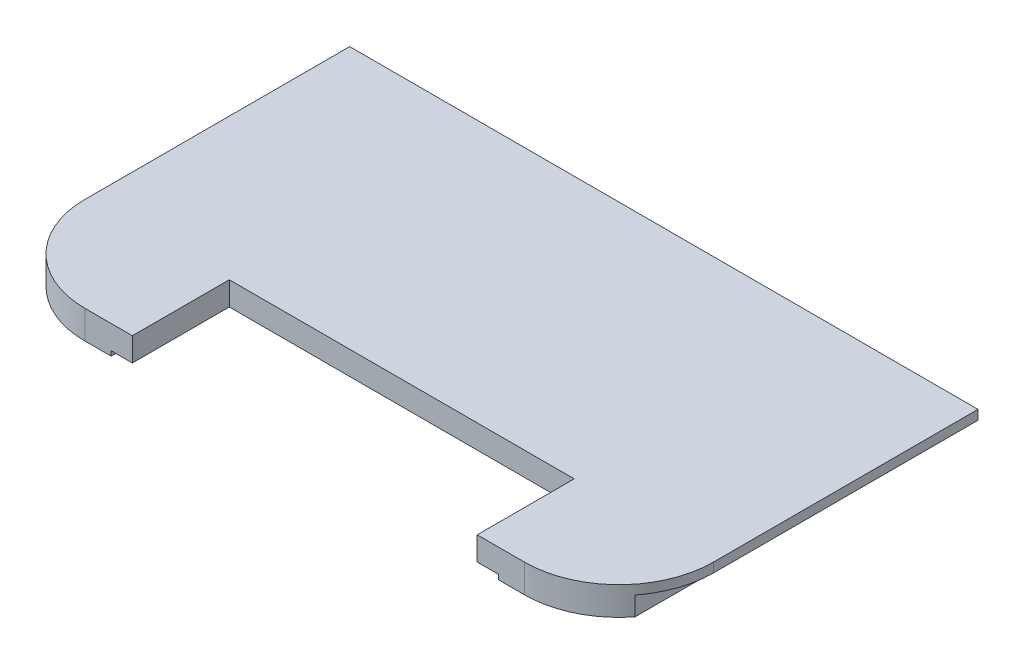
ISO-10303-21;
HEADER;
FILE_DESCRIPTION(('STEP AP214'),'2;1');
FILE_NAME('part.step','',(''),(''),'','','');
FILE_SCHEMA(('AUTOMOTIVE_DESIGN { 1 0 10303 214 1 1 1 1 }'));
ENDSEC;
DATA;
#1=APPLICATION_CONTEXT('core data for automotive mechanical design processes');
#2=APPLICATION_PROTOCOL_DEFINITION('international standard','automotive_design',2000,#1);
#3=PRODUCT_CONTEXT('',#1,'mechanical');
#4=PRODUCT('Part','Part','',(#3));
#5=PRODUCT_RELATED_PRODUCT_CATEGORY('part','',(#4));
#6=PRODUCT_DEFINITION_FORMATION('','',#4);
#7=PRODUCT_DEFINITION_CONTEXT('part definition',#1,'design');
#8=PRODUCT_DEFINITION('design','',#6,#7);
#9=PRODUCT_DEFINITION_SHAPE('','',#8);
#10=(LENGTH_UNIT() NAMED_UNIT(*) SI_UNIT(.MILLI.,.METRE.));
#11=(NAMED_UNIT(*) PLANE_ANGLE_UNIT() SI_UNIT($,.RADIAN.));
#12=(NAMED_UNIT(*) SI_UNIT($,.STERADIAN.) SOLID_ANGLE_UNIT());
#13=UNCERTAINTY_MEASURE_WITH_UNIT(LENGTH_MEASURE(1.E-05),#10,'distance_accuracy_value','');
#14=(GEOMETRIC_REPRESENTATION_CONTEXT(3) GLOBAL_UNCERTAINTY_ASSIGNED_CONTEXT((#13)) GLOBAL_UNIT_ASSIGNED_CONTEXT((#10,
#11,#12)) REPRESENTATION_CONTEXT('',''));
#15=CARTESIAN_POINT('',(0.,0.,0.));
#16=DIRECTION('',(0.,0.,1.));
#17=DIRECTION('',(1.,0.,0.));
#18=AXIS2_PLACEMENT_3D('',#15,#16,#17);
#19=CARTESIAN_POINT('',(211.1375,0.,-120.65));
#20=DIRECTION('',(0.,-1.,0.));
#21=DIRECTION('',(0.,0.,-1.));
#22=AXIS2_PLACEMENT_3D('',#19,#20,#21);
#23=PLANE('',#22);
#24=DIRECTION('',(0.,0.,1.));
#25=VECTOR('',#24,1.);
#26=CARTESIAN_POINT('',(197.64375,0.,-120.651));
#27=LINE('',#26,#25);
#28=CARTESIAN_POINT('',(197.64375,0.,-120.65));
#29=VERTEX_POINT('',#28);
#30=CARTESIAN_POINT('',(197.64375,0.,96.2859803880969));
#31=VERTEX_POINT('',#30);
#32=EDGE_CURVE('E333',#29,#31,#27,.T.);
#33=ORIENTED_EDGE('',*,*,#32,.T.);
#34=CARTESIAN_POINT('',(147.6375,0.,57.15));
#35=DIRECTION('',(0.,-1.,0.));
#36=DIRECTION('',(0.,0.,-1.));
#37=AXIS2_PLACEMENT_3D('',#34,#35,#36);
#38=CIRCLE('',#37,63.5);
#39=CARTESIAN_POINT('',(147.6375,0.,120.65));
#40=VERTEX_POINT('',#39);
#41=EDGE_CURVE('E308',#31,#40,#38,.T.);
#42=ORIENTED_EDGE('',*,*,#41,.T.);
#43=DIRECTION('',(1.,0.,0.));
#44=VECTOR('',#43,1.);
#45=CARTESIAN_POINT('',(-211.1375,0.,120.65));
#46=LINE('',#45,#44);
#47=CARTESIAN_POINT('',(130.175,0.,120.65));
#48=VERTEX_POINT('',#47);
#49=EDGE_CURVE('E298',#48,#40,#46,.T.);
#50=ORIENTED_EDGE('',*,*,#49,.F.);
#51=DIRECTION('',(0.,0.,1.));
#52=VECTOR('',#51,1.);
#53=CARTESIAN_POINT('',(130.175,0.,-120.651));
#54=LINE('',#53,#52);
#55=CARTESIAN_POINT('',(130.175,0.,-120.65));
#56=VERTEX_POINT('',#55);
#57=EDGE_CURVE('E344',#56,#48,#54,.T.);
#58=ORIENTED_EDGE('',*,*,#57,.F.);
#59=DIRECTION('',(-1.,0.,0.));
#60=VECTOR('',#59,1.);
#61=CARTESIAN_POINT('',(-211.1375,0.,-120.65));
#62=LINE('',#61,#60);
#63=EDGE_CURVE('E296',#29,#56,#62,.T.);
#64=ORIENTED_EDGE('',*,*,#63,.F.);
#65=EDGE_LOOP('',(#33,#42,#50,#58,#64));
#66=FACE_BOUND('',#65,.T.);
#67=ADVANCED_FACE('F31',(#66),#23,.T.);
#68=CARTESIAN_POINT('',(-147.6375,0.,120.65));
#69=VERTEX_POINT('',#68);
#70=CARTESIAN_POINT('',(-130.175,0.,120.65));
#71=VERTEX_POINT('',#70);
#72=EDGE_CURVE('E289',#69,#71,#46,.T.);
#73=ORIENTED_EDGE('',*,*,#72,.F.);
#74=CARTESIAN_POINT('',(-147.6375,0.,57.15));
#75=DIRECTION('',(0.,-1.,0.));
#76=DIRECTION('',(0.,0.,-1.));
#77=AXIS2_PLACEMENT_3D('',#74,#75,#76);
#78=CIRCLE('',#77,63.5);
#79=CARTESIAN_POINT('',(-197.64375,0.,96.2859803880969));
#80=VERTEX_POINT('',#79);
#81=EDGE_CURVE('E205',#69,#80,#78,.T.);
#82=ORIENTED_EDGE('',*,*,#81,.T.);
#83=DIRECTION('',(0.,0.,1.));
#84=VECTOR('',#83,1.);
#85=CARTESIAN_POINT('',(-197.64375,0.,-120.651));
#86=LINE('',#85,#84);
#87=CARTESIAN_POINT('',(-197.64375,0.,-120.65));
#88=VERTEX_POINT('',#87);
#89=EDGE_CURVE('E323',#88,#80,#86,.T.);
#90=ORIENTED_EDGE('',*,*,#89,.F.);
#91=CARTESIAN_POINT('',(-130.175,0.,-120.65));
#92=VERTEX_POINT('',#91);
#93=EDGE_CURVE('E281',#92,#88,#62,.T.);
#94=ORIENTED_EDGE('',*,*,#93,.F.);
#95=DIRECTION('',(0.,0.,1.));
#96=VECTOR('',#95,1.);
#97=CARTESIAN_POINT('',(-130.175,0.,-120.651));
#98=LINE('',#97,#96);
#99=EDGE_CURVE('E259',#92,#71,#98,.T.);
#100=ORIENTED_EDGE('',*,*,#99,.T.);
#101=EDGE_LOOP('',(#73,#82,#90,#94,#100));
#102=FACE_BOUND('',#101,.T.);
#103=ADVANCED_FACE('F321',(#102),#23,.T.);
#104=CARTESIAN_POINT('',(-211.1375,19.05,120.65));
#105=DIRECTION('',(0.,0.,-1.));
#106=DIRECTION('',(-1.,0.,0.));
#107=AXIS2_PLACEMENT_3D('',#104,#105,#106);
#108=PLANE('',#107);
#109=DIRECTION('',(1.,0.,0.));
#110=VECTOR('',#109,1.);
#111=CARTESIAN_POINT('',(-211.1375,19.05,120.65));
#112=LINE('',#111,#110);
#113=CARTESIAN_POINT('',(-147.6375,19.05,120.65));
#114=VERTEX_POINT('',#113);
#115=CARTESIAN_POINT('',(-115.8875,19.05,120.65));
#116=VERTEX_POINT('',#115);
#117=EDGE_CURVE('E294',#114,#116,#112,.T.);
#118=ORIENTED_EDGE('',*,*,#117,.F.);
#119=DIRECTION('',(0.,-1.,0.));
#120=VECTOR('',#119,1.);
#121=CARTESIAN_POINT('',(-147.6375,19.05,120.65));
#122=LINE('',#121,#120);
#123=EDGE_CURVE('E315',#114,#69,#122,.T.);
#124=ORIENTED_EDGE('',*,*,#123,.T.);
#125=ORIENTED_EDGE('',*,*,#72,.T.);
#126=DIRECTION('',(0.,-1.,0.));
#127=VECTOR('',#126,1.);
#128=CARTESIAN_POINT('',(-130.175,0.,120.65));
#129=LINE('',#128,#127);
#130=CARTESIAN_POINT('',(-130.175,3.175,120.65));
#131=VERTEX_POINT('',#130);
#132=EDGE_CURVE('E268',#131,#71,#129,.T.);
#133=ORIENTED_EDGE('',*,*,#132,.F.);
#134=DIRECTION('',(-1.,0.,0.));
#135=VECTOR('',#134,1.);
#136=CARTESIAN_POINT('',(-115.8875,3.175,120.65));
#137=LINE('',#136,#135);
#138=CARTESIAN_POINT('',(-115.8875,3.175,120.65));
#139=VERTEX_POINT('',#138);
#140=EDGE_CURVE('E349',#139,#131,#137,.T.);
#141=ORIENTED_EDGE('',*,*,#140,.F.);
#142=DIRECTION('',(0.,1.,0.));
#143=VECTOR('',#142,1.);
#144=CARTESIAN_POINT('',(-115.8875,-0.001000000000001,120.65));
#145=LINE('',#144,#143);
#146=EDGE_CURVE('E280',#139,#116,#145,.T.);
#147=ORIENTED_EDGE('',*,*,#146,.T.);
#148=EDGE_LOOP('',(#118,#124,#125,#133,#141,#147));
#149=FACE_BOUND('',#148,.T.);
#150=ADVANCED_FACE('F362',(#149),#108,.F.);
#151=CARTESIAN_POINT('',(211.1375,19.05,120.65));
#152=DIRECTION('',(-1.,0.,0.));
#153=DIRECTION('',(0.,0.,1.));
#154=AXIS2_PLACEMENT_3D('',#151,#152,#153);
#155=PLANE('',#154);
#156=DIRECTION('',(0.,-1.,0.));
#157=VECTOR('',#156,1.);
#158=CARTESIAN_POINT('',(211.1375,19.05,57.15));
#159=LINE('',#158,#157);
#160=CARTESIAN_POINT('',(211.1375,19.05,57.15));
#161=VERTEX_POINT('',#160);
#162=CARTESIAN_POINT('',(211.1375,12.7,57.15));
#163=VERTEX_POINT('',#162);
#164=EDGE_CURVE('E229',#161,#163,#159,.T.);
#165=ORIENTED_EDGE('',*,*,#164,.T.);
#166=DIRECTION('',(0.,0.,-1.));
#167=VECTOR('',#166,1.);
#168=CARTESIAN_POINT('',(211.1375,12.7,120.651));
#169=LINE('',#168,#167);
#170=CARTESIAN_POINT('',(211.1375,12.7,-120.65));
#171=VERTEX_POINT('',#170);
#172=EDGE_CURVE('E378',#163,#171,#169,.T.);
#173=ORIENTED_EDGE('',*,*,#172,.T.);
#174=DIRECTION('',(0.,-1.,0.));
#175=VECTOR('',#174,1.);
#176=CARTESIAN_POINT('',(211.1375,19.05,-120.65));
#177=LINE('',#176,#175);
#178=CARTESIAN_POINT('',(211.1375,19.05,-120.65));
#179=VERTEX_POINT('',#178);
#180=EDGE_CURVE('E230',#179,#171,#177,.T.);
#181=ORIENTED_EDGE('',*,*,#180,.F.);
#182=DIRECTION('',(0.,0.,-1.));
#183=VECTOR('',#182,1.);
#184=CARTESIAN_POINT('',(211.1375,19.05,120.65));
#185=LINE('',#184,#183);
#186=EDGE_CURVE('E286',#161,#179,#185,.T.);
#187=ORIENTED_EDGE('',*,*,#186,.F.);
#188=EDGE_LOOP('',(#165,#173,#181,#187));
#189=FACE_BOUND('',#188,.T.);
#190=ADVANCED_FACE('F407',(#189),#155,.F.);
#191=CARTESIAN_POINT('',(-211.1375,19.05,-120.65));
#192=DIRECTION('',(0.,0.,1.));
#193=DIRECTION('',(1.,0.,0.));
#194=AXIS2_PLACEMENT_3D('',#191,#192,#193);
#195=PLANE('',#194);
#196=DIRECTION('',(0.,-1.,0.));
#197=VECTOR('',#196,1.);
#198=CARTESIAN_POINT('',(-197.64375,0.,-120.65));
#199=LINE('',#198,#197);
#200=CARTESIAN_POINT('',(-197.64375,12.7,-120.65));
#201=VERTEX_POINT('',#200);
#202=EDGE_CURVE('E327',#201,#88,#199,.T.);
#203=ORIENTED_EDGE('',*,*,#202,.F.);
#204=DIRECTION('',(1.,0.,0.));
#205=VECTOR('',#204,1.);
#206=CARTESIAN_POINT('',(-211.1375,12.7000000000001,-120.65));
#207=LINE('',#206,#205);
#208=CARTESIAN_POINT('',(-211.1375,12.7000000000001,-120.65));
#209=VERTEX_POINT('',#208);
#210=EDGE_CURVE('E195',#209,#201,#207,.T.);
#211=ORIENTED_EDGE('',*,*,#210,.F.);
#212=DIRECTION('',(0.,-1.,0.));
#213=VECTOR('',#212,1.);
#214=CARTESIAN_POINT('',(-211.1375,19.05,-120.65));
#215=LINE('',#214,#213);
#216=CARTESIAN_POINT('',(-211.1375,19.05,-120.65));
#217=VERTEX_POINT('',#216);
#218=EDGE_CURVE('E194',#217,#209,#215,.T.);
#219=ORIENTED_EDGE('',*,*,#218,.F.);
#220=DIRECTION('',(-1.,0.,0.));
#221=VECTOR('',#220,1.);
#222=CARTESIAN_POINT('',(-211.1375,19.05,-120.65));
#223=LINE('',#222,#221);
#224=EDGE_CURVE('E288',#179,#217,#223,.T.);
#225=ORIENTED_EDGE('',*,*,#224,.F.);
#226=ORIENTED_EDGE('',*,*,#180,.T.);
#227=DIRECTION('',(1.,0.,0.));
#228=VECTOR('',#227,1.);
#229=CARTESIAN_POINT('',(197.64375,12.7,-120.65));
#230=LINE('',#229,#228);
#231=CARTESIAN_POINT('',(197.64375,12.7,-120.65));
#232=VERTEX_POINT('',#231);
#233=EDGE_CURVE('E185',#232,#171,#230,.T.);
#234=ORIENTED_EDGE('',*,*,#233,.F.);
#235=DIRECTION('',(0.,1.,0.));
#236=VECTOR('',#235,1.);
#237=CARTESIAN_POINT('',(197.64375,0.,-120.65));
#238=LINE('',#237,#236);
#239=EDGE_CURVE('E386',#29,#232,#238,.T.);
#240=ORIENTED_EDGE('',*,*,#239,.F.);
#241=ORIENTED_EDGE('',*,*,#63,.T.);
#242=DIRECTION('',(0.,-1.,0.));
#243=VECTOR('',#242,1.);
#244=CARTESIAN_POINT('',(130.175,0.,-120.65));
#245=LINE('',#244,#243);
#246=CARTESIAN_POINT('',(130.175,3.17500000000003,-120.65));
#247=VERTEX_POINT('',#246);
#248=EDGE_CURVE('E328',#247,#56,#245,.T.);
#249=ORIENTED_EDGE('',*,*,#248,.F.);
#250=DIRECTION('',(1.,0.,0.));
#251=VECTOR('',#250,1.);
#252=CARTESIAN_POINT('',(115.8875,3.17500000000003,-120.65));
#253=LINE('',#252,#251);
#254=CARTESIAN_POINT('',(115.8875,3.17500000000003,-120.65));
#255=VERTEX_POINT('',#254);
#256=EDGE_CURVE('E331',#255,#247,#253,.T.);
#257=ORIENTED_EDGE('',*,*,#256,.F.);
#258=DIRECTION('',(0.,1.,0.));
#259=VECTOR('',#258,1.);
#260=CARTESIAN_POINT('',(115.8875,0.,-120.65));
#261=LINE('',#260,#259);
#262=CARTESIAN_POINT('',(115.8875,0.,-120.65));
#263=VERTEX_POINT('',#262);
#264=EDGE_CURVE('E234',#263,#255,#261,.T.);
#265=ORIENTED_EDGE('',*,*,#264,.F.);
#266=CARTESIAN_POINT('',(-115.8875,0.,-120.65));
#267=VERTEX_POINT('',#266);
#268=EDGE_CURVE('E299',#263,#267,#62,.T.);
#269=ORIENTED_EDGE('',*,*,#268,.T.);
#270=DIRECTION('',(0.,-1.,0.));
#271=VECTOR('',#270,1.);
#272=CARTESIAN_POINT('',(-115.8875,0.,-120.65));
#273=LINE('',#272,#271);
#274=CARTESIAN_POINT('',(-115.8875,3.175,-120.65));
#275=VERTEX_POINT('',#274);
#276=EDGE_CURVE('E257',#275,#267,#273,.T.);
#277=ORIENTED_EDGE('',*,*,#276,.F.);
#278=DIRECTION('',(1.,0.,0.));
#279=VECTOR('',#278,1.);
#280=CARTESIAN_POINT('',(-115.8875,3.175,-120.65));
#281=LINE('',#280,#279);
#282=CARTESIAN_POINT('',(-130.175,3.175,-120.65));
#283=VERTEX_POINT('',#282);
#284=EDGE_CURVE('E258',#283,#275,#281,.T.);
#285=ORIENTED_EDGE('',*,*,#284,.F.);
#286=DIRECTION('',(0.,1.,0.));
#287=VECTOR('',#286,1.);
#288=CARTESIAN_POINT('',(-130.175,0.,-120.65));
#289=LINE('',#288,#287);
#290=EDGE_CURVE('E236',#92,#283,#289,.T.);
#291=ORIENTED_EDGE('',*,*,#290,.F.);
#292=ORIENTED_EDGE('',*,*,#93,.T.);
#293=EDGE_LOOP('',(#203,#211,#219,#225,#226,#234,#240,#241,#249,#257,#265,#269,#277,#285,#291,#292));
#294=FACE_BOUND('',#293,.T.);
#295=ADVANCED_FACE('F372',(#294),#195,.F.);
#296=CARTESIAN_POINT('',(-211.1375,19.05,120.65));
#297=DIRECTION('',(1.,0.,0.));
#298=DIRECTION('',(0.,0.,-1.));
#299=AXIS2_PLACEMENT_3D('',#296,#297,#298);
#300=PLANE('',#299);
#301=ORIENTED_EDGE('',*,*,#218,.T.);
#302=DIRECTION('',(0.,0.,-1.));
#303=VECTOR('',#302,1.);
#304=CARTESIAN_POINT('',(-211.1375,12.7000000000001,120.651));
#305=LINE('',#304,#303);
#306=CARTESIAN_POINT('',(-211.1375,12.7,57.15));
#307=VERTEX_POINT('',#306);
#308=EDGE_CURVE('E178',#307,#209,#305,.T.);
#309=ORIENTED_EDGE('',*,*,#308,.F.);
#310=DIRECTION('',(0.,-1.,0.));
#311=VECTOR('',#310,1.);
#312=CARTESIAN_POINT('',(-211.1375,19.05,57.15));
#313=LINE('',#312,#311);
#314=CARTESIAN_POINT('',(-211.1375,19.05,57.15));
#315=VERTEX_POINT('',#314);
#316=EDGE_CURVE('E191',#307,#315,#313,.F.);
#317=ORIENTED_EDGE('',*,*,#316,.T.);
#318=DIRECTION('',(0.,0.,1.));
#319=VECTOR('',#318,1.);
#320=CARTESIAN_POINT('',(-211.1375,19.05,120.65));
#321=LINE('',#320,#319);
#322=EDGE_CURVE('E291',#217,#315,#321,.T.);
#323=ORIENTED_EDGE('',*,*,#322,.F.);
#324=EDGE_LOOP('',(#301,#309,#317,#323));
#325=FACE_BOUND('',#324,.T.);
#326=ADVANCED_FACE('F189',(#325),#300,.F.);
#327=ORIENTED_EDGE('',*,*,#49,.T.);
#328=DIRECTION('',(0.,-1.,0.));
#329=VECTOR('',#328,1.);
#330=CARTESIAN_POINT('',(147.6375,19.05,120.65));
#331=LINE('',#330,#329);
#332=CARTESIAN_POINT('',(147.6375,19.05,120.65));
#333=VERTEX_POINT('',#332);
#334=EDGE_CURVE('E310',#40,#333,#331,.F.);
#335=ORIENTED_EDGE('',*,*,#334,.T.);
#336=CARTESIAN_POINT('',(115.8875,19.05,120.65));
#337=VERTEX_POINT('',#336);
#338=EDGE_CURVE('E293',#337,#333,#112,.T.);
#339=ORIENTED_EDGE('',*,*,#338,.F.);
#340=DIRECTION('',(0.,1.,0.));
#341=VECTOR('',#340,1.);
#342=CARTESIAN_POINT('',(115.8875,-0.001000000000001,120.65));
#343=LINE('',#342,#341);
#344=CARTESIAN_POINT('',(115.8875,3.17500000000003,120.65));
#345=VERTEX_POINT('',#344);
#346=EDGE_CURVE('E243',#345,#337,#343,.T.);
#347=ORIENTED_EDGE('',*,*,#346,.F.);
#348=DIRECTION('',(-1.,0.,0.));
#349=VECTOR('',#348,1.);
#350=CARTESIAN_POINT('',(115.8875,3.17500000000003,120.65));
#351=LINE('',#350,#349);
#352=CARTESIAN_POINT('',(130.175,3.17500000000003,120.65));
#353=VERTEX_POINT('',#352);
#354=EDGE_CURVE('E226',#353,#345,#351,.T.);
#355=ORIENTED_EDGE('',*,*,#354,.F.);
#356=DIRECTION('',(0.,1.,0.));
#357=VECTOR('',#356,1.);
#358=CARTESIAN_POINT('',(130.175,0.,120.65));
#359=LINE('',#358,#357);
#360=EDGE_CURVE('E339',#48,#353,#359,.T.);
#361=ORIENTED_EDGE('',*,*,#360,.F.);
#362=EDGE_LOOP('',(#327,#335,#339,#347,#355,#361));
#363=FACE_BOUND('',#362,.T.);
#364=ADVANCED_FACE('F404',(#363),#108,.F.);
#365=CARTESIAN_POINT('',(211.1375,19.05,-120.65));
#366=DIRECTION('',(0.,-1.,0.));
#367=DIRECTION('',(0.,0.,-1.));
#368=AXIS2_PLACEMENT_3D('',#365,#366,#367);
#369=PLANE('',#368);
#370=ORIENTED_EDGE('',*,*,#338,.T.);
#371=CARTESIAN_POINT('',(147.6375,19.05,57.15));
#372=DIRECTION('',(0.,-1.,0.));
#373=DIRECTION('',(0.,0.,-1.));
#374=AXIS2_PLACEMENT_3D('',#371,#372,#373);
#375=CIRCLE('',#374,63.5);
#376=EDGE_CURVE('E313',#333,#161,#375,.F.);
#377=ORIENTED_EDGE('',*,*,#376,.T.);
#378=ORIENTED_EDGE('',*,*,#186,.T.);
#379=ORIENTED_EDGE('',*,*,#224,.T.);
#380=ORIENTED_EDGE('',*,*,#322,.T.);
#381=CARTESIAN_POINT('',(-147.6375,19.05,57.15));
#382=DIRECTION('',(0.,-1.,0.));
#383=DIRECTION('',(0.,0.,-1.));
#384=AXIS2_PLACEMENT_3D('',#381,#382,#383);
#385=CIRCLE('',#384,63.5);
#386=EDGE_CURVE('E200',#315,#114,#385,.F.);
#387=ORIENTED_EDGE('',*,*,#386,.T.);
#388=ORIENTED_EDGE('',*,*,#117,.T.);
#389=DIRECTION('',(0.,0.,1.));
#390=VECTOR('',#389,1.);
#391=CARTESIAN_POINT('',(-115.8875,19.05,120.65));
#392=LINE('',#391,#390);
#393=CARTESIAN_POINT('',(-115.8875,19.05,55.499));
#394=VERTEX_POINT('',#393);
#395=EDGE_CURVE('E262',#394,#116,#392,.T.);
#396=ORIENTED_EDGE('',*,*,#395,.F.);
#397=DIRECTION('',(-1.,0.,0.));
#398=VECTOR('',#397,1.);
#399=CARTESIAN_POINT('',(-115.8875,19.05,55.499));
#400=LINE('',#399,#398);
#401=CARTESIAN_POINT('',(115.8875,19.05,55.499));
#402=VERTEX_POINT('',#401);
#403=EDGE_CURVE('E278',#402,#394,#400,.T.);
#404=ORIENTED_EDGE('',*,*,#403,.F.);
#405=DIRECTION('',(0.,0.,-1.));
#406=VECTOR('',#405,1.);
#407=CARTESIAN_POINT('',(115.8875,19.05,120.65));
#408=LINE('',#407,#406);
#409=EDGE_CURVE('E241',#337,#402,#408,.T.);
#410=ORIENTED_EDGE('',*,*,#409,.F.);
#411=EDGE_LOOP('',(#370,#377,#378,#379,#380,#387,#388,#396,#404,#410));
#412=FACE_BOUND('',#411,.T.);
#413=ADVANCED_FACE('F367',(#412),#369,.F.);
#414=DIRECTION('',(0.,0.,1.));
#415=VECTOR('',#414,1.);
#416=CARTESIAN_POINT('',(115.8875,0.,-120.651));
#417=LINE('',#416,#415);
#418=CARTESIAN_POINT('',(115.8875,0.,43.6497386859685));
#419=VERTEX_POINT('',#418);
#420=EDGE_CURVE('E251',#263,#419,#417,.T.);
#421=ORIENTED_EDGE('',*,*,#420,.T.);
#422=DIRECTION('',(-1.,0.,0.));
#423=VECTOR('',#422,1.);
#424=CARTESIAN_POINT('',(-115.8875,0.,43.6497386859688));
#425=LINE('',#424,#423);
#426=CARTESIAN_POINT('',(-115.8875,0.,43.6497386859685));
#427=VERTEX_POINT('',#426);
#428=EDGE_CURVE('E201',#419,#427,#425,.T.);
#429=ORIENTED_EDGE('',*,*,#428,.T.);
#430=DIRECTION('',(0.,0.,1.));
#431=VECTOR('',#430,1.);
#432=CARTESIAN_POINT('',(-115.8875,0.,-120.651));
#433=LINE('',#432,#431);
#434=EDGE_CURVE('E250',#267,#427,#433,.T.);
#435=ORIENTED_EDGE('',*,*,#434,.F.);
#436=ORIENTED_EDGE('',*,*,#268,.F.);
#437=EDGE_LOOP('',(#421,#429,#435,#436));
#438=FACE_BOUND('',#437,.T.);
#439=ADVANCED_FACE('F248',(#438),#23,.T.);
#440=CARTESIAN_POINT('',(-115.8875,-0.001000000000001,120.65));
#441=DIRECTION('',(-1.,0.,0.));
#442=DIRECTION('',(0.,0.,1.));
#443=AXIS2_PLACEMENT_3D('',#440,#441,#442);
#444=PLANE('',#443);
#445=ORIENTED_EDGE('',*,*,#146,.F.);
#446=DIRECTION('',(0.,0.,1.));
#447=VECTOR('',#446,1.);
#448=CARTESIAN_POINT('',(-115.8875,3.175,-120.651));
#449=LINE('',#448,#447);
#450=CARTESIAN_POINT('',(-115.8875,3.175,55.499));
#451=VERTEX_POINT('',#450);
#452=EDGE_CURVE('E273',#451,#139,#449,.T.);
#453=ORIENTED_EDGE('',*,*,#452,.F.);
#454=DIRECTION('',(0.,1.,0.));
#455=VECTOR('',#454,1.);
#456=CARTESIAN_POINT('',(-115.8875,-0.001000000000001,55.499));
#457=LINE('',#456,#455);
#458=EDGE_CURVE('E217',#451,#394,#457,.T.);
#459=ORIENTED_EDGE('',*,*,#458,.T.);
#460=ORIENTED_EDGE('',*,*,#395,.T.);
#461=EDGE_LOOP('',(#445,#453,#459,#460));
#462=FACE_BOUND('',#461,.T.);
#463=ADVANCED_FACE('F363',(#462),#444,.F.);
#464=CARTESIAN_POINT('',(-115.8875,-0.001000000000001,55.499));
#465=DIRECTION('',(0.,0.,-1.));
#466=DIRECTION('',(-1.,0.,0.));
#467=AXIS2_PLACEMENT_3D('',#464,#465,#466);
#468=PLANE('',#467);
#469=ORIENTED_EDGE('',*,*,#458,.F.);
#470=DIRECTION('',(1.,0.,0.));
#471=VECTOR('',#470,1.);
#472=CARTESIAN_POINT('',(115.8875,3.17500000000001,55.499));
#473=LINE('',#472,#471);
#474=CARTESIAN_POINT('',(115.8875,3.17500000000003,55.499));
#475=VERTEX_POINT('',#474);
#476=EDGE_CURVE('E39',#451,#475,#473,.T.);
#477=ORIENTED_EDGE('',*,*,#476,.T.);
#478=DIRECTION('',(0.,1.,0.));
#479=VECTOR('',#478,1.);
#480=CARTESIAN_POINT('',(115.8875,-0.001000000000001,55.499));
#481=LINE('',#480,#479);
#482=EDGE_CURVE('E215',#475,#402,#481,.T.);
#483=ORIENTED_EDGE('',*,*,#482,.T.);
#484=ORIENTED_EDGE('',*,*,#403,.T.);
#485=EDGE_LOOP('',(#469,#477,#483,#484));
#486=FACE_BOUND('',#485,.T.);
#487=ADVANCED_FACE('F212',(#486),#468,.F.);
#488=CARTESIAN_POINT('',(115.8875,-0.001000000000001,120.65));
#489=DIRECTION('',(1.,0.,0.));
#490=DIRECTION('',(0.,0.,-1.));
#491=AXIS2_PLACEMENT_3D('',#488,#489,#490);
#492=PLANE('',#491);
#493=ORIENTED_EDGE('',*,*,#482,.F.);
#494=DIRECTION('',(0.,0.,1.));
#495=VECTOR('',#494,1.);
#496=CARTESIAN_POINT('',(115.8875,3.17500000000003,120.65));
#497=LINE('',#496,#495);
#498=EDGE_CURVE('E220',#475,#345,#497,.T.);
#499=ORIENTED_EDGE('',*,*,#498,.T.);
#500=ORIENTED_EDGE('',*,*,#346,.T.);
#501=ORIENTED_EDGE('',*,*,#409,.T.);
#502=EDGE_LOOP('',(#493,#499,#500,#501));
#503=FACE_BOUND('',#502,.T.);
#504=ADVANCED_FACE('F239',(#503),#492,.F.);
#505=CARTESIAN_POINT('',(-115.8875,0.,-120.651));
#506=DIRECTION('',(1.,0.,0.));
#507=DIRECTION('',(0.,0.,-1.));
#508=AXIS2_PLACEMENT_3D('',#505,#506,#507);
#509=PLANE('',#508);
#510=ORIENTED_EDGE('',*,*,#434,.T.);
#511=DIRECTION('',(0.,0.258819045102522,0.965925826289068));
#512=VECTOR('',#511,1.);
#513=CARTESIAN_POINT('',(-115.8875,0.,43.6497386859688));
#514=LINE('',#513,#512);
#515=EDGE_CURVE('E46',#427,#451,#514,.T.);
#516=ORIENTED_EDGE('',*,*,#515,.T.);
#517=EDGE_CURVE('E272',#275,#451,#449,.T.);
#518=ORIENTED_EDGE('',*,*,#517,.F.);
#519=ORIENTED_EDGE('',*,*,#276,.T.);
#520=EDGE_LOOP('',(#510,#516,#518,#519));
#521=FACE_BOUND('',#520,.T.);
#522=ADVANCED_FACE('F254',(#521),#509,.F.);
#523=CARTESIAN_POINT('',(-130.175,0.,-120.651));
#524=DIRECTION('',(-1.,0.,0.));
#525=DIRECTION('',(0.,0.,1.));
#526=AXIS2_PLACEMENT_3D('',#523,#524,#525);
#527=PLANE('',#526);
#528=ORIENTED_EDGE('',*,*,#290,.T.);
#529=DIRECTION('',(0.,0.,1.));
#530=VECTOR('',#529,1.);
#531=CARTESIAN_POINT('',(-130.175,3.175,-120.651));
#532=LINE('',#531,#530);
#533=EDGE_CURVE('E265',#283,#131,#532,.T.);
#534=ORIENTED_EDGE('',*,*,#533,.T.);
#535=ORIENTED_EDGE('',*,*,#132,.T.);
#536=ORIENTED_EDGE('',*,*,#99,.F.);
#537=EDGE_LOOP('',(#528,#534,#535,#536));
#538=FACE_BOUND('',#537,.T.);
#539=ADVANCED_FACE('F418',(#538),#527,.F.);
#540=CARTESIAN_POINT('',(-115.8875,3.175,-120.651));
#541=DIRECTION('',(0.,1.,0.));
#542=DIRECTION('',(-1.,0.,0.));
#543=AXIS2_PLACEMENT_3D('',#540,#541,#542);
#544=PLANE('',#543);
#545=ORIENTED_EDGE('',*,*,#284,.T.);
#546=ORIENTED_EDGE('',*,*,#517,.T.);
#547=ORIENTED_EDGE('',*,*,#452,.T.);
#548=ORIENTED_EDGE('',*,*,#140,.T.);
#549=ORIENTED_EDGE('',*,*,#533,.F.);
#550=EDGE_LOOP('',(#545,#546,#547,#548,#549));
#551=FACE_BOUND('',#550,.T.);
#552=ADVANCED_FACE('F357',(#551),#544,.F.);
#553=CARTESIAN_POINT('',(115.8875,0.,-120.651));
#554=DIRECTION('',(-1.,0.,0.));
#555=DIRECTION('',(0.,0.,1.));
#556=AXIS2_PLACEMENT_3D('',#553,#554,#555);
#557=PLANE('',#556);
#558=DIRECTION('',(0.,0.,1.));
#559=VECTOR('',#558,1.);
#560=CARTESIAN_POINT('',(115.8875,3.17500000000003,-120.651));
#561=LINE('',#560,#559);
#562=EDGE_CURVE('E223',#255,#475,#561,.T.);
#563=ORIENTED_EDGE('',*,*,#562,.T.);
#564=DIRECTION('',(0.,-0.258819045102522,-0.965925826289068));
#565=VECTOR('',#564,1.);
#566=CARTESIAN_POINT('',(115.8875,0.,43.6497386859688));
#567=LINE('',#566,#565);
#568=EDGE_CURVE('E11',#475,#419,#567,.T.);
#569=ORIENTED_EDGE('',*,*,#568,.T.);
#570=ORIENTED_EDGE('',*,*,#420,.F.);
#571=ORIENTED_EDGE('',*,*,#264,.T.);
#572=EDGE_LOOP('',(#563,#569,#570,#571));
#573=FACE_BOUND('',#572,.T.);
#574=ADVANCED_FACE('F232',(#573),#557,.F.);
#575=CARTESIAN_POINT('',(115.8875,3.17500000000003,-120.651));
#576=DIRECTION('',(0.,1.,0.));
#577=DIRECTION('',(-1.,0.,0.));
#578=AXIS2_PLACEMENT_3D('',#575,#576,#577);
#579=PLANE('',#578);
#580=ORIENTED_EDGE('',*,*,#256,.T.);
#581=DIRECTION('',(0.,0.,1.));
#582=VECTOR('',#581,1.);
#583=CARTESIAN_POINT('',(130.175,3.17500000000003,-120.651));
#584=LINE('',#583,#582);
#585=EDGE_CURVE('E237',#247,#353,#584,.T.);
#586=ORIENTED_EDGE('',*,*,#585,.T.);
#587=ORIENTED_EDGE('',*,*,#354,.T.);
#588=ORIENTED_EDGE('',*,*,#498,.F.);
#589=ORIENTED_EDGE('',*,*,#562,.F.);
#590=EDGE_LOOP('',(#580,#586,#587,#588,#589));
#591=FACE_BOUND('',#590,.T.);
#592=ADVANCED_FACE('F222',(#591),#579,.F.);
#593=CARTESIAN_POINT('',(130.175,0.,-120.651));
#594=DIRECTION('',(1.,0.,0.));
#595=DIRECTION('',(0.,0.,-1.));
#596=AXIS2_PLACEMENT_3D('',#593,#594,#595);
#597=PLANE('',#596);
#598=ORIENTED_EDGE('',*,*,#248,.T.);
#599=ORIENTED_EDGE('',*,*,#57,.T.);
#600=ORIENTED_EDGE('',*,*,#360,.T.);
#601=ORIENTED_EDGE('',*,*,#585,.F.);
#602=EDGE_LOOP('',(#598,#599,#600,#601));
#603=FACE_BOUND('',#602,.T.);
#604=ADVANCED_FACE('F415',(#603),#597,.F.);
#605=CARTESIAN_POINT('',(-197.64375,0.,-120.651));
#606=DIRECTION('',(1.,0.,0.));
#607=DIRECTION('',(0.,0.,-1.));
#608=AXIS2_PLACEMENT_3D('',#605,#606,#607);
#609=PLANE('',#608);
#610=ORIENTED_EDGE('',*,*,#89,.T.);
#611=DIRECTION('',(0.,-1.,0.));
#612=VECTOR('',#611,1.);
#613=CARTESIAN_POINT('',(-197.64375,0.,96.2859803880969));
#614=LINE('',#613,#612);
#615=CARTESIAN_POINT('',(-197.64375,12.7,96.2859803880969));
#616=VERTEX_POINT('',#615);
#617=EDGE_CURVE('E202',#80,#616,#614,.F.);
#618=ORIENTED_EDGE('',*,*,#617,.T.);
#619=DIRECTION('',(0.,0.,-1.));
#620=VECTOR('',#619,1.);
#621=CARTESIAN_POINT('',(-197.64375,12.7,120.651));
#622=LINE('',#621,#620);
#623=EDGE_CURVE('E181',#616,#201,#622,.T.);
#624=ORIENTED_EDGE('',*,*,#623,.T.);
#625=ORIENTED_EDGE('',*,*,#202,.T.);
#626=EDGE_LOOP('',(#610,#618,#624,#625));
#627=FACE_BOUND('',#626,.T.);
#628=ADVANCED_FACE('F326',(#627),#609,.F.);
#629=CARTESIAN_POINT('',(197.64375,0.,-120.651));
#630=DIRECTION('',(-1.,0.,0.));
#631=DIRECTION('',(0.,0.,1.));
#632=AXIS2_PLACEMENT_3D('',#629,#630,#631);
#633=PLANE('',#632);
#634=ORIENTED_EDGE('',*,*,#239,.T.);
#635=DIRECTION('',(0.,0.,-1.));
#636=VECTOR('',#635,1.);
#637=CARTESIAN_POINT('',(197.64375,12.7,120.651));
#638=LINE('',#637,#636);
#639=CARTESIAN_POINT('',(197.64375,12.7,96.2859803880969));
#640=VERTEX_POINT('',#639);
#641=EDGE_CURVE('E377',#640,#232,#638,.T.);
#642=ORIENTED_EDGE('',*,*,#641,.F.);
#643=DIRECTION('',(0.,-1.,0.));
#644=VECTOR('',#643,1.);
#645=CARTESIAN_POINT('',(197.64375,3.17500000000003,96.2859803880969));
#646=LINE('',#645,#644);
#647=EDGE_CURVE('E306',#640,#31,#646,.T.);
#648=ORIENTED_EDGE('',*,*,#647,.T.);
#649=ORIENTED_EDGE('',*,*,#32,.F.);
#650=EDGE_LOOP('',(#634,#642,#648,#649));
#651=FACE_BOUND('',#650,.T.);
#652=ADVANCED_FACE('F412',(#651),#633,.F.);
#653=CARTESIAN_POINT('',(147.6375,19.05,57.15));
#654=DIRECTION('',(0.,-1.,0.));
#655=DIRECTION('',(0.,0.,-1.));
#656=AXIS2_PLACEMENT_3D('',#653,#654,#655);
#657=CYLINDRICAL_SURFACE('',#656,63.5);
#658=ORIENTED_EDGE('',*,*,#647,.F.);
#659=CARTESIAN_POINT('',(147.6375,12.7,57.15));
#660=DIRECTION('',(0.,1.,0.));
#661=DIRECTION('',(-1.,0.,0.));
#662=AXIS2_PLACEMENT_3D('',#659,#660,#661);
#663=CIRCLE('',#662,63.5);
#664=EDGE_CURVE('E381',#640,#163,#663,.T.);
#665=ORIENTED_EDGE('',*,*,#664,.T.);
#666=ORIENTED_EDGE('',*,*,#164,.F.);
#667=ORIENTED_EDGE('',*,*,#376,.F.);
#668=ORIENTED_EDGE('',*,*,#334,.F.);
#669=ORIENTED_EDGE('',*,*,#41,.F.);
#670=EDGE_LOOP('',(#658,#665,#666,#667,#668,#669));
#671=FACE_BOUND('',#670,.T.);
#672=ADVANCED_FACE('F398',(#671),#657,.T.);
#673=CARTESIAN_POINT('',(-147.6375,19.05,57.15));
#674=DIRECTION('',(0.,-1.,0.));
#675=DIRECTION('',(0.,0.,-1.));
#676=AXIS2_PLACEMENT_3D('',#673,#674,#675);
#677=CYLINDRICAL_SURFACE('',#676,63.5);
#678=CARTESIAN_POINT('',(-147.6375,12.7,57.15));
#679=DIRECTION('',(0.,1.,0.));
#680=DIRECTION('',(-1.,0.,0.));
#681=AXIS2_PLACEMENT_3D('',#678,#679,#680);
#682=CIRCLE('',#681,63.5);
#683=EDGE_CURVE('E174',#307,#616,#682,.T.);
#684=ORIENTED_EDGE('',*,*,#683,.T.);
#685=ORIENTED_EDGE('',*,*,#617,.F.);
#686=ORIENTED_EDGE('',*,*,#81,.F.);
#687=ORIENTED_EDGE('',*,*,#123,.F.);
#688=ORIENTED_EDGE('',*,*,#386,.F.);
#689=ORIENTED_EDGE('',*,*,#316,.F.);
#690=EDGE_LOOP('',(#684,#685,#686,#687,#688,#689));
#691=FACE_BOUND('',#690,.T.);
#692=ADVANCED_FACE('F198',(#691),#677,.T.);
#693=CARTESIAN_POINT('',(197.64375,12.7,120.651));
#694=DIRECTION('',(0.,1.,0.));
#695=DIRECTION('',(-1.,0.,0.));
#696=AXIS2_PLACEMENT_3D('',#693,#694,#695);
#697=PLANE('',#696);
#698=ORIENTED_EDGE('',*,*,#641,.T.);
#699=ORIENTED_EDGE('',*,*,#233,.T.);
#700=ORIENTED_EDGE('',*,*,#172,.F.);
#701=ORIENTED_EDGE('',*,*,#664,.F.);
#702=EDGE_LOOP('',(#698,#699,#700,#701));
#703=FACE_BOUND('',#702,.T.);
#704=ADVANCED_FACE('F410',(#703),#697,.F.);
#705=CARTESIAN_POINT('',(-211.1375,12.7000000000001,120.651));
#706=DIRECTION('',(0.,1.,0.));
#707=DIRECTION('',(-1.,0.,0.));
#708=AXIS2_PLACEMENT_3D('',#705,#706,#707);
#709=PLANE('',#708);
#710=ORIENTED_EDGE('',*,*,#308,.T.);
#711=ORIENTED_EDGE('',*,*,#210,.T.);
#712=ORIENTED_EDGE('',*,*,#623,.F.);
#713=ORIENTED_EDGE('',*,*,#683,.F.);
#714=EDGE_LOOP('',(#710,#711,#712,#713));
#715=FACE_BOUND('',#714,.T.);
#716=ADVANCED_FACE('F176',(#715),#709,.F.);
#717=CARTESIAN_POINT('',(211.1375,0.,43.6497386859688));
#718=DIRECTION('',(0.,-0.965925826289068,0.258819045102522));
#719=DIRECTION('',(0.,-0.258819045102522,-0.965925826289068));
#720=AXIS2_PLACEMENT_3D('',#717,#718,#719);
#721=PLANE('',#720);
#722=ORIENTED_EDGE('',*,*,#568,.F.);
#723=ORIENTED_EDGE('',*,*,#476,.F.);
#724=ORIENTED_EDGE('',*,*,#515,.F.);
#725=ORIENTED_EDGE('',*,*,#428,.F.);
#726=EDGE_LOOP('',(#722,#723,#724,#725));
#727=FACE_BOUND('',#726,.T.);
#728=ADVANCED_FACE('F33',(#727),#721,.T.);
#729=CLOSED_SHELL('',(#67,#103,#150,#190,#295,#326,#364,#413,#439,#463,#487,#504,#522,#539,#552,
#574,#592,#604,#628,#652,#672,#692,#704,#716,#728));
#730=MANIFOLD_SOLID_BREP('B2',#729);
#731=ADVANCED_BREP_SHAPE_REPRESENTATION('',(#18,#730),#14);
#732=SHAPE_DEFINITION_REPRESENTATION(#9,#731);
ENDSEC;
END-ISO-10303-21;
